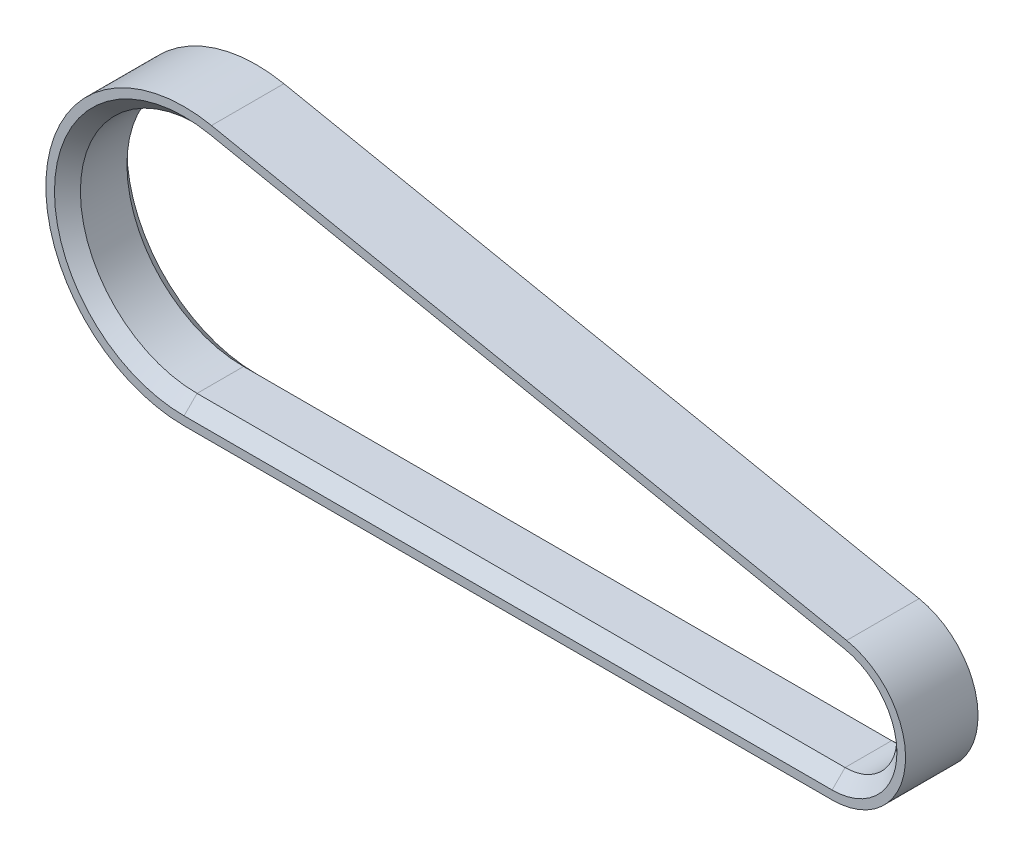
ISO-10303-21;
HEADER;
FILE_DESCRIPTION(('STEP AP214'),'2;1');
FILE_NAME('part.step','',(''),(''),'','','');
FILE_SCHEMA(('AUTOMOTIVE_DESIGN { 1 0 10303 214 1 1 1 1 }'));
ENDSEC;
DATA;
#1=APPLICATION_CONTEXT('core data for automotive mechanical design processes');
#2=APPLICATION_PROTOCOL_DEFINITION('international standard','automotive_design',2000,#1);
#3=PRODUCT_CONTEXT('',#1,'mechanical');
#4=PRODUCT('Part','Part','',(#3));
#5=PRODUCT_RELATED_PRODUCT_CATEGORY('part','',(#4));
#6=PRODUCT_DEFINITION_FORMATION('','',#4);
#7=PRODUCT_DEFINITION_CONTEXT('part definition',#1,'design');
#8=PRODUCT_DEFINITION('design','',#6,#7);
#9=PRODUCT_DEFINITION_SHAPE('','',#8);
#10=(LENGTH_UNIT() NAMED_UNIT(*) SI_UNIT(.MILLI.,.METRE.));
#11=(NAMED_UNIT(*) PLANE_ANGLE_UNIT() SI_UNIT($,.RADIAN.));
#12=(NAMED_UNIT(*) SI_UNIT($,.STERADIAN.) SOLID_ANGLE_UNIT());
#13=UNCERTAINTY_MEASURE_WITH_UNIT(LENGTH_MEASURE(1.E-05),#10,'distance_accuracy_value','');
#14=(GEOMETRIC_REPRESENTATION_CONTEXT(3) GLOBAL_UNCERTAINTY_ASSIGNED_CONTEXT((#13)) GLOBAL_UNIT_ASSIGNED_CONTEXT((#10,
#11,#12)) REPRESENTATION_CONTEXT('',''));
#15=CARTESIAN_POINT('',(0.,0.,0.));
#16=DIRECTION('',(0.,0.,1.));
#17=DIRECTION('',(1.,0.,0.));
#18=AXIS2_PLACEMENT_3D('',#15,#16,#17);
#19=CARTESIAN_POINT('',(0.,0.,-5.38582776273531));
#20=DIRECTION('',(0.,0.,-1.));
#21=DIRECTION('',(-1.,0.,0.));
#22=AXIS2_PLACEMENT_3D('',#19,#20,#21);
#23=CONICAL_SURFACE('',#22,27.,0.785398163397449);
#24=DIRECTION('',(0.,-0.707106781186548,-0.707106781186548));
#25=VECTOR('',#24,1.);
#26=CARTESIAN_POINT('',(1.11022302462516E-13,-30.,-8.38582776273531));
#27=LINE('',#26,#25);
#28=CARTESIAN_POINT('',(1.38777878078145E-13,-27.,-5.38582776273531));
#29=VERTEX_POINT('',#28);
#30=CARTESIAN_POINT('',(1.11022302462516E-13,-30.,-8.38582776273531));
#31=VERTEX_POINT('',#30);
#32=EDGE_CURVE('E274',#29,#31,#27,.T.);
#33=ORIENTED_EDGE('',*,*,#32,.T.);
#34=CARTESIAN_POINT('',(0.,0.,-8.38582776273531));
#35=DIRECTION('',(0.,0.,-1.));
#36=DIRECTION('',(-1.,0.,0.));
#37=AXIS2_PLACEMENT_3D('',#34,#35,#36);
#38=CIRCLE('',#37,30.);
#39=CARTESIAN_POINT('',(5.94059405940594,29.4059405940594,-8.38582776273531));
#40=VERTEX_POINT('',#39);
#41=EDGE_CURVE('E28',#31,#40,#38,.T.);
#42=ORIENTED_EDGE('',*,*,#41,.T.);
#43=CARTESIAN_POINT('',(5.34653465346546,26.4653465346535,-5.38582776273533));
#44=DIRECTION('',(0.14002114478941,0.693104666707607,-0.707106781186548));
#45=VECTOR('',#44,1.);
#46=LINE('',#43,#45);
#47=CARTESIAN_POINT('',(5.34653465346568,26.4653465346534,-5.38582776273531));
#48=VERTEX_POINT('',#47);
#49=EDGE_CURVE('E220',#48,#40,#46,.T.);
#50=ORIENTED_EDGE('',*,*,#49,.F.);
#51=CARTESIAN_POINT('',(0.,0.,-5.38582776273531));
#52=DIRECTION('',(0.,0.,-1.));
#53=DIRECTION('',(-1.,0.,0.));
#54=AXIS2_PLACEMENT_3D('',#51,#52,#53);
#55=CIRCLE('',#54,27.);
#56=EDGE_CURVE('E11',#29,#48,#55,.T.);
#57=ORIENTED_EDGE('',*,*,#56,.F.);
#58=EDGE_LOOP('',(#33,#42,#50,#57));
#59=FACE_BOUND('',#58,.T.);
#60=ADVANCED_FACE('F17',(#59),#23,.F.);
#61=CARTESIAN_POINT('',(0.,0.,0.));
#62=DIRECTION('',(0.,0.,-1.));
#63=DIRECTION('',(-1.,0.,0.));
#64=AXIS2_PLACEMENT_3D('',#61,#62,#63);
#65=CYLINDRICAL_SURFACE('',#64,32.);
#66=DIRECTION('',(0.,0.,1.));
#67=VECTOR('',#66,1.);
#68=CARTESIAN_POINT('',(1.11022302462516E-13,-32.,8.38582776273531));
#69=LINE('',#68,#67);
#70=CARTESIAN_POINT('',(1.11022302462516E-13,-32.,-8.38582776273531));
#71=VERTEX_POINT('',#70);
#72=CARTESIAN_POINT('',(1.11022302462516E-13,-32.,8.38582776273531));
#73=VERTEX_POINT('',#72);
#74=EDGE_CURVE('E271',#71,#73,#69,.T.);
#75=ORIENTED_EDGE('',*,*,#74,.T.);
#76=CARTESIAN_POINT('',(0.,0.,8.38582776273531));
#77=DIRECTION('',(0.,0.,-1.));
#78=DIRECTION('',(-1.,0.,0.));
#79=AXIS2_PLACEMENT_3D('',#76,#77,#78);
#80=CIRCLE('',#79,32.);
#81=CARTESIAN_POINT('',(6.33663366336633,31.3663366336634,8.38582776273531));
#82=VERTEX_POINT('',#81);
#83=EDGE_CURVE('E242',#73,#82,#80,.T.);
#84=ORIENTED_EDGE('',*,*,#83,.T.);
#85=CARTESIAN_POINT('',(6.33663366336631,31.3663366336634,-8.3858277627353));
#86=DIRECTION('',(0.,0.,1.));
#87=VECTOR('',#86,1.);
#88=LINE('',#85,#87);
#89=CARTESIAN_POINT('',(6.33663366336633,31.3663366336634,-8.38582776273531));
#90=VERTEX_POINT('',#89);
#91=EDGE_CURVE('E249',#90,#82,#88,.T.);
#92=ORIENTED_EDGE('',*,*,#91,.F.);
#93=CARTESIAN_POINT('',(0.,0.,-8.38582776273531));
#94=DIRECTION('',(0.,0.,-1.));
#95=DIRECTION('',(-1.,0.,0.));
#96=AXIS2_PLACEMENT_3D('',#93,#94,#95);
#97=CIRCLE('',#96,32.);
#98=EDGE_CURVE('E237',#71,#90,#97,.T.);
#99=ORIENTED_EDGE('',*,*,#98,.F.);
#100=EDGE_LOOP('',(#75,#84,#92,#99));
#101=FACE_BOUND('',#100,.T.);
#102=ADVANCED_FACE('F254',(#101),#65,.T.);
#103=CARTESIAN_POINT('',(0.,0.,8.38582776273531));
#104=DIRECTION('',(0.,0.,1.));
#105=DIRECTION('',(1.,0.,0.));
#106=AXIS2_PLACEMENT_3D('',#103,#104,#105);
#107=CONICAL_SURFACE('',#106,30.,0.78539816339745);
#108=DIRECTION('',(0.,0.707106781186548,-0.707106781186547));
#109=VECTOR('',#108,1.);
#110=CARTESIAN_POINT('',(1.38777878078145E-13,-27.,5.38582776273532));
#111=LINE('',#110,#109);
#112=CARTESIAN_POINT('',(1.11022302462516E-13,-30.,8.38582776273531));
#113=VERTEX_POINT('',#112);
#114=CARTESIAN_POINT('',(1.38777878078145E-13,-27.,5.38582776273532));
#115=VERTEX_POINT('',#114);
#116=EDGE_CURVE('E275',#113,#115,#111,.T.);
#117=ORIENTED_EDGE('',*,*,#116,.T.);
#118=CARTESIAN_POINT('',(0.,0.,5.38582776273532));
#119=DIRECTION('',(0.,0.,-1.));
#120=DIRECTION('',(-1.,0.,0.));
#121=AXIS2_PLACEMENT_3D('',#118,#119,#120);
#122=CIRCLE('',#121,27.);
#123=CARTESIAN_POINT('',(5.34653465346568,26.4653465346534,5.38582776273532));
#124=VERTEX_POINT('',#123);
#125=EDGE_CURVE('E212',#115,#124,#122,.T.);
#126=ORIENTED_EDGE('',*,*,#125,.T.);
#127=CARTESIAN_POINT('',(5.94059405940611,29.4059405940594,8.38582776273535));
#128=DIRECTION('',(-0.140021144789459,-0.693104666707597,-0.707106781186548));
#129=VECTOR('',#128,1.);
#130=LINE('',#127,#129);
#131=CARTESIAN_POINT('',(5.94059405940593,29.4059405940594,8.38582776273531));
#132=VERTEX_POINT('',#131);
#133=EDGE_CURVE('E297',#132,#124,#130,.T.);
#134=ORIENTED_EDGE('',*,*,#133,.F.);
#135=CARTESIAN_POINT('',(0.,0.,8.38582776273531));
#136=DIRECTION('',(0.,0.,-1.));
#137=DIRECTION('',(-1.,0.,0.));
#138=AXIS2_PLACEMENT_3D('',#135,#136,#137);
#139=CIRCLE('',#138,30.);
#140=EDGE_CURVE('E219',#113,#132,#139,.T.);
#141=ORIENTED_EDGE('',*,*,#140,.F.);
#142=EDGE_LOOP('',(#117,#126,#134,#141));
#143=FACE_BOUND('',#142,.T.);
#144=ADVANCED_FACE('F205',(#143),#107,.F.);
#145=CARTESIAN_POINT('',(0.,0.,0.));
#146=DIRECTION('',(0.,0.,-1.));
#147=DIRECTION('',(-1.,0.,0.));
#148=AXIS2_PLACEMENT_3D('',#145,#146,#147);
#149=CYLINDRICAL_SURFACE('',#148,27.);
#150=DIRECTION('',(0.,0.,-1.));
#151=VECTOR('',#150,1.);
#152=CARTESIAN_POINT('',(1.38777878078145E-13,-27.,-5.38582776273531));
#153=LINE('',#152,#151);
#154=EDGE_CURVE('E123',#115,#29,#153,.T.);
#155=ORIENTED_EDGE('',*,*,#154,.T.);
#156=ORIENTED_EDGE('',*,*,#56,.T.);
#157=CARTESIAN_POINT('',(5.34653465346532,26.4653465346535,5.38582776273532));
#158=DIRECTION('',(0.,0.,-1.));
#159=VECTOR('',#158,1.);
#160=LINE('',#157,#159);
#161=EDGE_CURVE('E36',#124,#48,#160,.T.);
#162=ORIENTED_EDGE('',*,*,#161,.F.);
#163=ORIENTED_EDGE('',*,*,#125,.F.);
#164=EDGE_LOOP('',(#155,#156,#162,#163));
#165=FACE_BOUND('',#164,.T.);
#166=ADVANCED_FACE('F201',(#165),#149,.F.);
#167=CARTESIAN_POINT('',(150.,-30.,-8.38582776273531));
#168=DIRECTION('',(0.,0.707106781186548,-0.707106781186548));
#169=DIRECTION('',(0.,0.707106781186548,0.707106781186548));
#170=AXIS2_PLACEMENT_3D('',#167,#168,#169);
#171=PLANE('',#170);
#172=DIRECTION('',(0.,-0.707106781186548,-0.707106781186548));
#173=VECTOR('',#172,1.);
#174=CARTESIAN_POINT('',(150.,-30.,-8.38582776273531));
#175=LINE('',#174,#173);
#176=CARTESIAN_POINT('',(150.,-27.,-5.38582776273531));
#177=VERTEX_POINT('',#176);
#178=CARTESIAN_POINT('',(150.,-30.,-8.38582776273531));
#179=VERTEX_POINT('',#178);
#180=EDGE_CURVE('E120',#177,#179,#175,.T.);
#181=ORIENTED_EDGE('',*,*,#180,.T.);
#182=DIRECTION('',(-1.,0.,0.));
#183=VECTOR('',#182,1.);
#184=CARTESIAN_POINT('',(150.,-30.,-8.38582776273531));
#185=LINE('',#184,#183);
#186=EDGE_CURVE('E286',#179,#31,#185,.T.);
#187=ORIENTED_EDGE('',*,*,#186,.T.);
#188=ORIENTED_EDGE('',*,*,#32,.F.);
#189=DIRECTION('',(-1.,0.,0.));
#190=VECTOR('',#189,1.);
#191=CARTESIAN_POINT('',(150.,-27.,-5.38582776273531));
#192=LINE('',#191,#190);
#193=EDGE_CURVE('E294',#177,#29,#192,.T.);
#194=ORIENTED_EDGE('',*,*,#193,.F.);
#195=EDGE_LOOP('',(#181,#187,#188,#194));
#196=FACE_BOUND('',#195,.T.);
#197=ADVANCED_FACE('F197',(#196),#171,.T.);
#198=CARTESIAN_POINT('',(150.,-32.,8.38582776273531));
#199=DIRECTION('',(0.,-1.,0.));
#200=DIRECTION('',(1.,0.,0.));
#201=AXIS2_PLACEMENT_3D('',#198,#199,#200);
#202=PLANE('',#201);
#203=DIRECTION('',(0.,0.,1.));
#204=VECTOR('',#203,1.);
#205=CARTESIAN_POINT('',(150.,-32.,8.38582776273531));
#206=LINE('',#205,#204);
#207=CARTESIAN_POINT('',(150.,-32.,-8.38582776273531));
#208=VERTEX_POINT('',#207);
#209=CARTESIAN_POINT('',(150.,-32.,8.38582776273531));
#210=VERTEX_POINT('',#209);
#211=EDGE_CURVE('E280',#208,#210,#206,.T.);
#212=ORIENTED_EDGE('',*,*,#211,.T.);
#213=DIRECTION('',(-1.,0.,0.));
#214=VECTOR('',#213,1.);
#215=CARTESIAN_POINT('',(150.,-32.,8.38582776273531));
#216=LINE('',#215,#214);
#217=EDGE_CURVE('E278',#210,#73,#216,.T.);
#218=ORIENTED_EDGE('',*,*,#217,.T.);
#219=ORIENTED_EDGE('',*,*,#74,.F.);
#220=DIRECTION('',(-1.,0.,0.));
#221=VECTOR('',#220,1.);
#222=CARTESIAN_POINT('',(150.,-32.,-8.38582776273531));
#223=LINE('',#222,#221);
#224=EDGE_CURVE('E283',#208,#71,#223,.T.);
#225=ORIENTED_EDGE('',*,*,#224,.F.);
#226=EDGE_LOOP('',(#212,#218,#219,#225));
#227=FACE_BOUND('',#226,.T.);
#228=ADVANCED_FACE('F193',(#227),#202,.T.);
#229=CARTESIAN_POINT('',(150.,-27.,5.38582776273532));
#230=DIRECTION('',(0.,0.707106781186547,0.707106781186548));
#231=DIRECTION('',(0.,-0.707106781186548,0.707106781186547));
#232=AXIS2_PLACEMENT_3D('',#229,#230,#231);
#233=PLANE('',#232);
#234=DIRECTION('',(0.,0.707106781186548,-0.707106781186547));
#235=VECTOR('',#234,1.);
#236=CARTESIAN_POINT('',(150.,-27.,5.38582776273532));
#237=LINE('',#236,#235);
#238=CARTESIAN_POINT('',(150.,-30.,8.38582776273531));
#239=VERTEX_POINT('',#238);
#240=CARTESIAN_POINT('',(150.,-27.,5.38582776273532));
#241=VERTEX_POINT('',#240);
#242=EDGE_CURVE('E145',#239,#241,#237,.T.);
#243=ORIENTED_EDGE('',*,*,#242,.T.);
#244=DIRECTION('',(-1.,0.,0.));
#245=VECTOR('',#244,1.);
#246=CARTESIAN_POINT('',(150.,-27.,5.38582776273532));
#247=LINE('',#246,#245);
#248=EDGE_CURVE('E289',#241,#115,#247,.T.);
#249=ORIENTED_EDGE('',*,*,#248,.T.);
#250=ORIENTED_EDGE('',*,*,#116,.F.);
#251=DIRECTION('',(-1.,0.,0.));
#252=VECTOR('',#251,1.);
#253=CARTESIAN_POINT('',(150.,-30.,8.38582776273531));
#254=LINE('',#253,#252);
#255=EDGE_CURVE('E284',#239,#113,#254,.T.);
#256=ORIENTED_EDGE('',*,*,#255,.F.);
#257=EDGE_LOOP('',(#243,#249,#250,#256));
#258=FACE_BOUND('',#257,.T.);
#259=ADVANCED_FACE('F189',(#258),#233,.T.);
#260=CARTESIAN_POINT('',(150.,-27.,-5.38582776273531));
#261=DIRECTION('',(0.,1.,0.));
#262=DIRECTION('',(-1.,0.,0.));
#263=AXIS2_PLACEMENT_3D('',#260,#261,#262);
#264=PLANE('',#263);
#265=DIRECTION('',(0.,0.,-1.));
#266=VECTOR('',#265,1.);
#267=CARTESIAN_POINT('',(150.,-27.,-5.38582776273531));
#268=LINE('',#267,#266);
#269=EDGE_CURVE('E142',#241,#177,#268,.T.);
#270=ORIENTED_EDGE('',*,*,#269,.T.);
#271=ORIENTED_EDGE('',*,*,#193,.T.);
#272=ORIENTED_EDGE('',*,*,#154,.F.);
#273=ORIENTED_EDGE('',*,*,#248,.F.);
#274=EDGE_LOOP('',(#270,#271,#272,#273));
#275=FACE_BOUND('',#274,.T.);
#276=ADVANCED_FACE('F186',(#275),#264,.T.);
#277=CARTESIAN_POINT('',(150.,-14.9999999999997,-5.38582776273531));
#278=DIRECTION('',(0.,0.,-1.));
#279=DIRECTION('',(-1.,0.,0.));
#280=AXIS2_PLACEMENT_3D('',#277,#278,#279);
#281=CONICAL_SURFACE('',#280,12.,0.785398163397449);
#282=DIRECTION('',(0.140021144789416,0.693104666707606,-0.707106781186548));
#283=VECTOR('',#282,1.);
#284=CARTESIAN_POINT('',(152.970297029703,-0.297029702969989,-8.38582776273531));
#285=LINE('',#284,#283);
#286=CARTESIAN_POINT('',(152.376237623762,-3.23762376237593,-5.38582776273531));
#287=VERTEX_POINT('',#286);
#288=CARTESIAN_POINT('',(152.970297029703,-0.297029702969989,-8.38582776273531));
#289=VERTEX_POINT('',#288);
#290=EDGE_CURVE('E117',#287,#289,#285,.T.);
#291=ORIENTED_EDGE('',*,*,#290,.T.);
#292=CARTESIAN_POINT('',(150.,-14.9999999999997,-8.38582776273531));
#293=DIRECTION('',(0.,0.,-1.));
#294=DIRECTION('',(-1.,0.,0.));
#295=AXIS2_PLACEMENT_3D('',#292,#293,#294);
#296=CIRCLE('',#295,15.);
#297=EDGE_CURVE('E124',#289,#179,#296,.T.);
#298=ORIENTED_EDGE('',*,*,#297,.T.);
#299=ORIENTED_EDGE('',*,*,#180,.F.);
#300=CARTESIAN_POINT('',(150.,-14.9999999999997,-5.38582776273531));
#301=DIRECTION('',(0.,0.,-1.));
#302=DIRECTION('',(-1.,0.,0.));
#303=AXIS2_PLACEMENT_3D('',#300,#301,#302);
#304=CIRCLE('',#303,12.);
#305=EDGE_CURVE('E112',#287,#177,#304,.T.);
#306=ORIENTED_EDGE('',*,*,#305,.F.);
#307=EDGE_LOOP('',(#291,#298,#299,#306));
#308=FACE_BOUND('',#307,.T.);
#309=ADVANCED_FACE('F114',(#308),#281,.F.);
#310=CARTESIAN_POINT('',(150.,-14.9999999999997,0.));
#311=DIRECTION('',(0.,0.,-1.));
#312=DIRECTION('',(-1.,0.,0.));
#313=AXIS2_PLACEMENT_3D('',#310,#311,#312);
#314=CYLINDRICAL_SURFACE('',#313,17.);
#315=DIRECTION('',(0.,0.,1.));
#316=VECTOR('',#315,1.);
#317=CARTESIAN_POINT('',(153.366336633663,1.66336633663397,8.38582776273531));
#318=LINE('',#317,#316);
#319=CARTESIAN_POINT('',(153.366336633663,1.66336633663397,-8.38582776273531));
#320=VERTEX_POINT('',#319);
#321=CARTESIAN_POINT('',(153.366336633663,1.66336633663397,8.38582776273531));
#322=VERTEX_POINT('',#321);
#323=EDGE_CURVE('E139',#320,#322,#318,.T.);
#324=ORIENTED_EDGE('',*,*,#323,.T.);
#325=CARTESIAN_POINT('',(150.,-14.9999999999997,8.38582776273531));
#326=DIRECTION('',(0.,0.,-1.));
#327=DIRECTION('',(-1.,0.,0.));
#328=AXIS2_PLACEMENT_3D('',#325,#326,#327);
#329=CIRCLE('',#328,17.);
#330=EDGE_CURVE('E318',#322,#210,#329,.T.);
#331=ORIENTED_EDGE('',*,*,#330,.T.);
#332=ORIENTED_EDGE('',*,*,#211,.F.);
#333=CARTESIAN_POINT('',(150.,-14.9999999999997,-8.38582776273531));
#334=DIRECTION('',(0.,0.,-1.));
#335=DIRECTION('',(-1.,0.,0.));
#336=AXIS2_PLACEMENT_3D('',#333,#334,#335);
#337=CIRCLE('',#336,17.);
#338=EDGE_CURVE('E315',#320,#208,#337,.T.);
#339=ORIENTED_EDGE('',*,*,#338,.F.);
#340=EDGE_LOOP('',(#324,#331,#332,#339));
#341=FACE_BOUND('',#340,.T.);
#342=ADVANCED_FACE('F179',(#341),#314,.T.);
#343=CARTESIAN_POINT('',(150.,-14.9999999999997,8.38582776273531));
#344=DIRECTION('',(0.,0.,1.));
#345=DIRECTION('',(1.,0.,0.));
#346=AXIS2_PLACEMENT_3D('',#343,#344,#345);
#347=CONICAL_SURFACE('',#346,15.,0.785398163397449);
#348=DIRECTION('',(-0.140021144789415,-0.693104666707606,-0.707106781186547));
#349=VECTOR('',#348,1.);
#350=CARTESIAN_POINT('',(152.376237623762,-3.23762376237593,5.38582776273532));
#351=LINE('',#350,#349);
#352=CARTESIAN_POINT('',(152.970297029703,-0.297029702969995,8.38582776273531));
#353=VERTEX_POINT('',#352);
#354=CARTESIAN_POINT('',(152.376237623762,-3.23762376237593,5.38582776273532));
#355=VERTEX_POINT('',#354);
#356=EDGE_CURVE('E376',#353,#355,#351,.T.);
#357=ORIENTED_EDGE('',*,*,#356,.T.);
#358=CARTESIAN_POINT('',(150.,-14.9999999999997,5.38582776273532));
#359=DIRECTION('',(0.,0.,-1.));
#360=DIRECTION('',(-1.,0.,0.));
#361=AXIS2_PLACEMENT_3D('',#358,#359,#360);
#362=CIRCLE('',#361,12.);
#363=EDGE_CURVE('E130',#355,#241,#362,.T.);
#364=ORIENTED_EDGE('',*,*,#363,.T.);
#365=ORIENTED_EDGE('',*,*,#242,.F.);
#366=CARTESIAN_POINT('',(150.,-14.9999999999997,8.38582776273531));
#367=DIRECTION('',(0.,0.,-1.));
#368=DIRECTION('',(-1.,0.,0.));
#369=AXIS2_PLACEMENT_3D('',#366,#367,#368);
#370=CIRCLE('',#369,15.);
#371=EDGE_CURVE('E339',#353,#239,#370,.T.);
#372=ORIENTED_EDGE('',*,*,#371,.F.);
#373=EDGE_LOOP('',(#357,#364,#365,#372));
#374=FACE_BOUND('',#373,.T.);
#375=ADVANCED_FACE('F176',(#374),#347,.F.);
#376=CARTESIAN_POINT('',(150.,-14.9999999999997,0.));
#377=DIRECTION('',(0.,0.,-1.));
#378=DIRECTION('',(-1.,0.,0.));
#379=AXIS2_PLACEMENT_3D('',#376,#377,#378);
#380=CYLINDRICAL_SURFACE('',#379,12.);
#381=DIRECTION('',(0.,0.,-1.));
#382=VECTOR('',#381,1.);
#383=CARTESIAN_POINT('',(152.376237623762,-3.23762376237593,-5.38582776273531));
#384=LINE('',#383,#382);
#385=EDGE_CURVE('E127',#355,#287,#384,.T.);
#386=ORIENTED_EDGE('',*,*,#385,.T.);
#387=ORIENTED_EDGE('',*,*,#305,.T.);
#388=ORIENTED_EDGE('',*,*,#269,.F.);
#389=ORIENTED_EDGE('',*,*,#363,.F.);
#390=EDGE_LOOP('',(#386,#387,#388,#389));
#391=FACE_BOUND('',#390,.T.);
#392=ADVANCED_FACE('F128',(#391),#380,.F.);
#393=CARTESIAN_POINT('',(152.376237623762,-3.23762376237593,-5.38582776273531));
#394=DIRECTION('',(0.198019801980196,0.980198019801981,0.));
#395=DIRECTION('',(-0.980198019801981,0.198019801980196,0.));
#396=AXIS2_PLACEMENT_3D('',#393,#394,#395);
#397=PLANE('',#396);
#398=ORIENTED_EDGE('',*,*,#161,.T.);
#399=DIRECTION('',(-0.980198019801981,0.198019801980196,0.));
#400=VECTOR('',#399,1.);
#401=CARTESIAN_POINT('',(152.376237623762,-3.23762376237593,-5.38582776273531));
#402=LINE('',#401,#400);
#403=EDGE_CURVE('E135',#287,#48,#402,.T.);
#404=ORIENTED_EDGE('',*,*,#403,.F.);
#405=ORIENTED_EDGE('',*,*,#385,.F.);
#406=DIRECTION('',(-0.980198019801981,0.198019801980196,0.));
#407=VECTOR('',#406,1.);
#408=CARTESIAN_POINT('',(152.376237623762,-3.23762376237593,5.38582776273532));
#409=LINE('',#408,#407);
#410=EDGE_CURVE('E161',#355,#124,#409,.T.);
#411=ORIENTED_EDGE('',*,*,#410,.T.);
#412=EDGE_LOOP('',(#398,#404,#405,#411));
#413=FACE_BOUND('',#412,.T.);
#414=ADVANCED_FACE('F141',(#413),#397,.F.);
#415=CARTESIAN_POINT('',(152.970297029703,-0.297029702969989,-8.38582776273531));
#416=DIRECTION('',(0.140021144789414,0.693104666707606,0.707106781186548));
#417=DIRECTION('',(0.,-0.714142142783907,0.700000714213929));
#418=AXIS2_PLACEMENT_3D('',#415,#416,#417);
#419=PLANE('',#418);
#420=ORIENTED_EDGE('',*,*,#49,.T.);
#421=DIRECTION('',(-0.980198019801981,0.198019801980196,0.));
#422=VECTOR('',#421,1.);
#423=CARTESIAN_POINT('',(152.970297029703,-0.297029702969989,-8.38582776273531));
#424=LINE('',#423,#422);
#425=EDGE_CURVE('E138',#289,#40,#424,.T.);
#426=ORIENTED_EDGE('',*,*,#425,.F.);
#427=ORIENTED_EDGE('',*,*,#290,.F.);
#428=ORIENTED_EDGE('',*,*,#403,.T.);
#429=EDGE_LOOP('',(#420,#426,#427,#428));
#430=FACE_BOUND('',#429,.T.);
#431=ADVANCED_FACE('F134',(#430),#419,.F.);
#432=CARTESIAN_POINT('',(153.366336633663,1.66336633663397,-8.38582776273531));
#433=DIRECTION('',(0.,0.,1.));
#434=DIRECTION('',(0.,-1.,0.));
#435=AXIS2_PLACEMENT_3D('',#432,#433,#434);
#436=PLANE('',#435);
#437=DIRECTION('',(-0.980198019801981,0.198019801980196,0.));
#438=VECTOR('',#437,1.);
#439=CARTESIAN_POINT('',(153.366336633663,1.66336633663397,-8.38582776273531));
#440=LINE('',#439,#438);
#441=EDGE_CURVE('E147',#320,#90,#440,.T.);
#442=ORIENTED_EDGE('',*,*,#441,.F.);
#443=ORIENTED_EDGE('',*,*,#338,.T.);
#444=ORIENTED_EDGE('',*,*,#224,.T.);
#445=ORIENTED_EDGE('',*,*,#98,.T.);
#446=EDGE_LOOP('',(#442,#443,#444,#445));
#447=FACE_BOUND('',#446,.T.);
#448=ORIENTED_EDGE('',*,*,#425,.T.);
#449=ORIENTED_EDGE('',*,*,#41,.F.);
#450=ORIENTED_EDGE('',*,*,#186,.F.);
#451=ORIENTED_EDGE('',*,*,#297,.F.);
#452=EDGE_LOOP('',(#448,#449,#450,#451));
#453=FACE_BOUND('',#452,.T.);
#454=ADVANCED_FACE('F309',(#447,#453),#436,.F.);
#455=CARTESIAN_POINT('',(153.366336633663,1.66336633663397,8.38582776273531));
#456=DIRECTION('',(-0.198019801980196,-0.980198019801981,0.));
#457=DIRECTION('',(0.980198019801981,-0.198019801980196,0.));
#458=AXIS2_PLACEMENT_3D('',#455,#456,#457);
#459=PLANE('',#458);
#460=ORIENTED_EDGE('',*,*,#91,.T.);
#461=DIRECTION('',(-0.980198019801981,0.198019801980196,0.));
#462=VECTOR('',#461,1.);
#463=CARTESIAN_POINT('',(153.366336633663,1.66336633663397,8.38582776273531));
#464=LINE('',#463,#462);
#465=EDGE_CURVE('E347',#322,#82,#464,.T.);
#466=ORIENTED_EDGE('',*,*,#465,.F.);
#467=ORIENTED_EDGE('',*,*,#323,.F.);
#468=ORIENTED_EDGE('',*,*,#441,.T.);
#469=EDGE_LOOP('',(#460,#466,#467,#468));
#470=FACE_BOUND('',#469,.T.);
#471=ADVANCED_FACE('F360',(#470),#459,.F.);
#472=CARTESIAN_POINT('',(152.970297029703,-0.297029702969995,8.38582776273531));
#473=DIRECTION('',(0.,0.,-1.));
#474=DIRECTION('',(-1.,0.,0.));
#475=AXIS2_PLACEMENT_3D('',#472,#473,#474);
#476=PLANE('',#475);
#477=DIRECTION('',(-0.980198019801981,0.198019801980196,0.));
#478=VECTOR('',#477,1.);
#479=CARTESIAN_POINT('',(152.970297029703,-0.297029702969995,8.38582776273531));
#480=LINE('',#479,#478);
#481=EDGE_CURVE('E337',#353,#132,#480,.T.);
#482=ORIENTED_EDGE('',*,*,#481,.F.);
#483=ORIENTED_EDGE('',*,*,#371,.T.);
#484=ORIENTED_EDGE('',*,*,#255,.T.);
#485=ORIENTED_EDGE('',*,*,#140,.T.);
#486=EDGE_LOOP('',(#482,#483,#484,#485));
#487=FACE_BOUND('',#486,.T.);
#488=ORIENTED_EDGE('',*,*,#465,.T.);
#489=ORIENTED_EDGE('',*,*,#83,.F.);
#490=ORIENTED_EDGE('',*,*,#217,.F.);
#491=ORIENTED_EDGE('',*,*,#330,.F.);
#492=EDGE_LOOP('',(#488,#489,#490,#491));
#493=FACE_BOUND('',#492,.T.);
#494=ADVANCED_FACE('F335',(#487,#493),#476,.F.);
#495=CARTESIAN_POINT('',(152.376237623762,-3.23762376237593,5.38582776273532));
#496=DIRECTION('',(0.140021144789414,0.693104666707606,-0.707106781186548));
#497=DIRECTION('',(0.,0.714142142783907,0.700000714213929));
#498=AXIS2_PLACEMENT_3D('',#495,#496,#497);
#499=PLANE('',#498);
#500=ORIENTED_EDGE('',*,*,#133,.T.);
#501=ORIENTED_EDGE('',*,*,#410,.F.);
#502=ORIENTED_EDGE('',*,*,#356,.F.);
#503=ORIENTED_EDGE('',*,*,#481,.T.);
#504=EDGE_LOOP('',(#500,#501,#502,#503));
#505=FACE_BOUND('',#504,.T.);
#506=ADVANCED_FACE('F378',(#505),#499,.F.);
#507=CLOSED_SHELL('',(#60,#102,#144,#166,#197,#228,#259,#276,#309,#342,#375,#392,#414,#431,#454,
#471,#494,#506));
#508=MANIFOLD_SOLID_BREP('B1',#507);
#509=ADVANCED_BREP_SHAPE_REPRESENTATION('',(#18,#508),#14);
#510=SHAPE_DEFINITION_REPRESENTATION(#9,#509);
ENDSEC;
END-ISO-10303-21;
